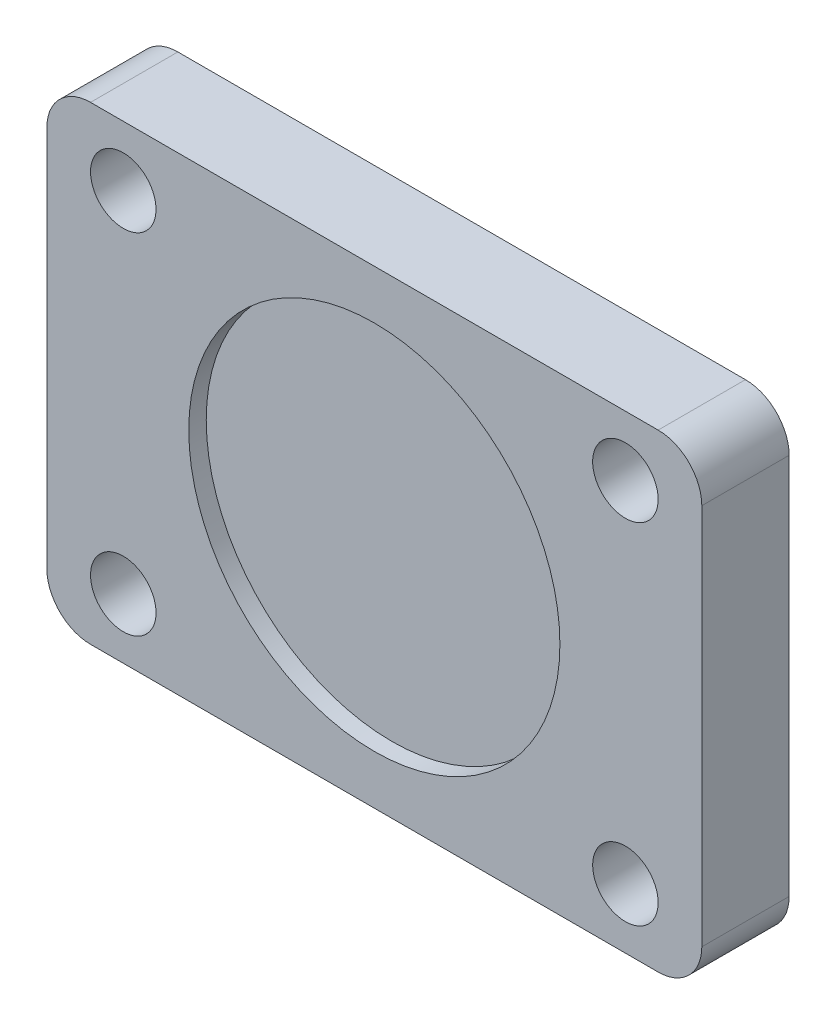
ISO-10303-21;
HEADER;
FILE_DESCRIPTION(('STEP AP214'),'2;1');
FILE_NAME('part.step','',(''),(''),'','','');
FILE_SCHEMA(('AUTOMOTIVE_DESIGN { 1 0 10303 214 1 1 1 1 }'));
ENDSEC;
DATA;
#1=APPLICATION_CONTEXT('core data for automotive mechanical design processes');
#2=APPLICATION_PROTOCOL_DEFINITION('international standard','automotive_design',2000,#1);
#3=PRODUCT_CONTEXT('',#1,'mechanical');
#4=PRODUCT('Part','Part','',(#3));
#5=PRODUCT_RELATED_PRODUCT_CATEGORY('part','',(#4));
#6=PRODUCT_DEFINITION_FORMATION('','',#4);
#7=PRODUCT_DEFINITION_CONTEXT('part definition',#1,'design');
#8=PRODUCT_DEFINITION('design','',#6,#7);
#9=PRODUCT_DEFINITION_SHAPE('','',#8);
#10=(LENGTH_UNIT() NAMED_UNIT(*) SI_UNIT(.MILLI.,.METRE.));
#11=(NAMED_UNIT(*) PLANE_ANGLE_UNIT() SI_UNIT($,.RADIAN.));
#12=(NAMED_UNIT(*) SI_UNIT($,.STERADIAN.) SOLID_ANGLE_UNIT());
#13=UNCERTAINTY_MEASURE_WITH_UNIT(LENGTH_MEASURE(1.E-05),#10,'distance_accuracy_value','');
#14=(GEOMETRIC_REPRESENTATION_CONTEXT(3) GLOBAL_UNCERTAINTY_ASSIGNED_CONTEXT((#13)) GLOBAL_UNIT_ASSIGNED_CONTEXT((#10,
#11,#12)) REPRESENTATION_CONTEXT('',''));
#15=CARTESIAN_POINT('',(0.,0.,0.));
#16=DIRECTION('',(0.,0.,1.));
#17=DIRECTION('',(1.,0.,0.));
#18=AXIS2_PLACEMENT_3D('',#15,#16,#17);
#19=CARTESIAN_POINT('',(0.,0.,8.));
#20=DIRECTION('',(0.,0.,1.));
#21=DIRECTION('',(1.,0.,0.));
#22=AXIS2_PLACEMENT_3D('',#19,#20,#21);
#23=PLANE('',#22);
#24=CARTESIAN_POINT('',(0.,0.,8.));
#25=DIRECTION('',(0.,0.,1.));
#26=DIRECTION('',(1.,0.,0.));
#27=AXIS2_PLACEMENT_3D('',#24,#25,#26);
#28=CIRCLE('',#27,17.);
#29=CARTESIAN_POINT('',(17.,0.,8.));
#30=VERTEX_POINT('',#29);
#31=EDGE_CURVE('E207',#30,#30,#28,.T.);
#32=ORIENTED_EDGE('',*,*,#31,.F.);
#33=EDGE_LOOP('',(#32));
#34=FACE_BOUND('',#33,.T.);
#35=CARTESIAN_POINT('',(-23.,-16.,8.));
#36=DIRECTION('',(0.,0.,1.));
#37=DIRECTION('',(1.,0.,0.));
#38=AXIS2_PLACEMENT_3D('',#35,#36,#37);
#39=CIRCLE('',#38,3.);
#40=CARTESIAN_POINT('',(-20.,-16.,8.));
#41=VERTEX_POINT('',#40);
#42=EDGE_CURVE('E192',#41,#41,#39,.T.);
#43=ORIENTED_EDGE('',*,*,#42,.F.);
#44=EDGE_LOOP('',(#43));
#45=FACE_BOUND('',#44,.T.);
#46=CARTESIAN_POINT('',(23.,16.,8.));
#47=DIRECTION('',(0.,0.,1.));
#48=DIRECTION('',(1.,0.,0.));
#49=AXIS2_PLACEMENT_3D('',#46,#47,#48);
#50=CIRCLE('',#49,3.);
#51=CARTESIAN_POINT('',(26.,16.,8.));
#52=VERTEX_POINT('',#51);
#53=EDGE_CURVE('E133',#52,#52,#50,.T.);
#54=ORIENTED_EDGE('',*,*,#53,.F.);
#55=EDGE_LOOP('',(#54));
#56=FACE_BOUND('',#55,.T.);
#57=DIRECTION('',(1.,0.,0.));
#58=VECTOR('',#57,1.);
#59=CARTESIAN_POINT('',(-30.,-21.5,8.));
#60=LINE('',#59,#58);
#61=CARTESIAN_POINT('',(-26.,-21.5,8.));
#62=VERTEX_POINT('',#61);
#63=CARTESIAN_POINT('',(26.,-21.5,8.));
#64=VERTEX_POINT('',#63);
#65=EDGE_CURVE('E142',#62,#64,#60,.T.);
#66=ORIENTED_EDGE('',*,*,#65,.T.);
#67=CARTESIAN_POINT('',(26.,-17.5,8.));
#68=DIRECTION('',(0.,0.,1.));
#69=DIRECTION('',(1.,0.,0.));
#70=AXIS2_PLACEMENT_3D('',#67,#68,#69);
#71=CIRCLE('',#70,4.);
#72=CARTESIAN_POINT('',(30.,-17.5,8.));
#73=VERTEX_POINT('',#72);
#74=EDGE_CURVE('E161',#64,#73,#71,.T.);
#75=ORIENTED_EDGE('',*,*,#74,.T.);
#76=DIRECTION('',(0.,1.,0.));
#77=VECTOR('',#76,1.);
#78=CARTESIAN_POINT('',(30.,21.5,8.));
#79=LINE('',#78,#77);
#80=CARTESIAN_POINT('',(30.,17.5,8.));
#81=VERTEX_POINT('',#80);
#82=EDGE_CURVE('E125',#73,#81,#79,.T.);
#83=ORIENTED_EDGE('',*,*,#82,.T.);
#84=CARTESIAN_POINT('',(26.,17.5,8.));
#85=DIRECTION('',(0.,0.,1.));
#86=DIRECTION('',(1.,0.,0.));
#87=AXIS2_PLACEMENT_3D('',#84,#85,#86);
#88=CIRCLE('',#87,4.);
#89=CARTESIAN_POINT('',(26.,21.5,8.));
#90=VERTEX_POINT('',#89);
#91=EDGE_CURVE('E156',#81,#90,#88,.T.);
#92=ORIENTED_EDGE('',*,*,#91,.T.);
#93=DIRECTION('',(-1.,0.,0.));
#94=VECTOR('',#93,1.);
#95=CARTESIAN_POINT('',(-30.,21.5,8.));
#96=LINE('',#95,#94);
#97=CARTESIAN_POINT('',(-26.,21.5,8.));
#98=VERTEX_POINT('',#97);
#99=EDGE_CURVE('E172',#90,#98,#96,.T.);
#100=ORIENTED_EDGE('',*,*,#99,.T.);
#101=CARTESIAN_POINT('',(-26.,17.5,8.));
#102=DIRECTION('',(0.,0.,1.));
#103=DIRECTION('',(1.,0.,0.));
#104=AXIS2_PLACEMENT_3D('',#101,#102,#103);
#105=CIRCLE('',#104,4.);
#106=CARTESIAN_POINT('',(-30.,17.5,8.));
#107=VERTEX_POINT('',#106);
#108=EDGE_CURVE('E61',#98,#107,#105,.T.);
#109=ORIENTED_EDGE('',*,*,#108,.T.);
#110=DIRECTION('',(0.,-1.,0.));
#111=VECTOR('',#110,1.);
#112=CARTESIAN_POINT('',(-30.,21.5,8.));
#113=LINE('',#112,#111);
#114=CARTESIAN_POINT('',(-30.,-17.5,8.));
#115=VERTEX_POINT('',#114);
#116=EDGE_CURVE('E180',#107,#115,#113,.T.);
#117=ORIENTED_EDGE('',*,*,#116,.T.);
#118=CARTESIAN_POINT('',(-26.,-17.5,8.));
#119=DIRECTION('',(0.,0.,1.));
#120=DIRECTION('',(1.,0.,0.));
#121=AXIS2_PLACEMENT_3D('',#118,#119,#120);
#122=CIRCLE('',#121,4.);
#123=EDGE_CURVE('E159',#115,#62,#122,.T.);
#124=ORIENTED_EDGE('',*,*,#123,.T.);
#125=EDGE_LOOP('',(#66,#75,#83,#92,#100,#109,#117,#124));
#126=FACE_BOUND('',#125,.T.);
#127=CARTESIAN_POINT('',(23.,-16.,8.));
#128=DIRECTION('',(0.,0.,1.));
#129=DIRECTION('',(-1.,0.,0.));
#130=AXIS2_PLACEMENT_3D('',#127,#128,#129);
#131=CIRCLE('',#130,3.);
#132=CARTESIAN_POINT('',(20.,-16.,8.));
#133=VERTEX_POINT('',#132);
#134=EDGE_CURVE('E187',#133,#133,#131,.T.);
#135=ORIENTED_EDGE('',*,*,#134,.F.);
#136=EDGE_LOOP('',(#135));
#137=FACE_BOUND('',#136,.T.);
#138=CARTESIAN_POINT('',(-23.,16.,8.));
#139=DIRECTION('',(0.,0.,1.));
#140=DIRECTION('',(-1.,0.,0.));
#141=AXIS2_PLACEMENT_3D('',#138,#139,#140);
#142=CIRCLE('',#141,3.);
#143=CARTESIAN_POINT('',(-26.,16.,8.));
#144=VERTEX_POINT('',#143);
#145=EDGE_CURVE('E198',#144,#144,#142,.T.);
#146=ORIENTED_EDGE('',*,*,#145,.F.);
#147=EDGE_LOOP('',(#146));
#148=FACE_BOUND('',#147,.T.);
#149=ADVANCED_FACE('F39',(#34,#45,#56,#126,#137,#148),#23,.T.);
#150=CARTESIAN_POINT('',(0.,0.,0.));
#151=DIRECTION('',(0.,0.,1.));
#152=DIRECTION('',(1.,0.,0.));
#153=AXIS2_PLACEMENT_3D('',#150,#151,#152);
#154=PLANE('',#153);
#155=DIRECTION('',(0.,1.,0.));
#156=VECTOR('',#155,1.);
#157=CARTESIAN_POINT('',(30.,21.5,0.));
#158=LINE('',#157,#156);
#159=CARTESIAN_POINT('',(30.,-17.5,0.));
#160=VERTEX_POINT('',#159);
#161=CARTESIAN_POINT('',(30.,17.5,0.));
#162=VERTEX_POINT('',#161);
#163=EDGE_CURVE('E122',#160,#162,#158,.T.);
#164=ORIENTED_EDGE('',*,*,#163,.F.);
#165=CARTESIAN_POINT('',(26.,-17.5,0.));
#166=DIRECTION('',(0.,0.,1.));
#167=DIRECTION('',(1.,0.,0.));
#168=AXIS2_PLACEMENT_3D('',#165,#166,#167);
#169=CIRCLE('',#168,4.);
#170=CARTESIAN_POINT('',(26.,-21.5,0.));
#171=VERTEX_POINT('',#170);
#172=EDGE_CURVE('E105',#160,#171,#169,.F.);
#173=ORIENTED_EDGE('',*,*,#172,.T.);
#174=DIRECTION('',(1.,0.,0.));
#175=VECTOR('',#174,1.);
#176=CARTESIAN_POINT('',(-30.,-21.5,0.));
#177=LINE('',#176,#175);
#178=CARTESIAN_POINT('',(-26.,-21.5,0.));
#179=VERTEX_POINT('',#178);
#180=EDGE_CURVE('E146',#179,#171,#177,.T.);
#181=ORIENTED_EDGE('',*,*,#180,.F.);
#182=CARTESIAN_POINT('',(-26.,-17.5,0.));
#183=DIRECTION('',(0.,0.,1.));
#184=DIRECTION('',(1.,0.,0.));
#185=AXIS2_PLACEMENT_3D('',#182,#183,#184);
#186=CIRCLE('',#185,4.);
#187=CARTESIAN_POINT('',(-30.,-17.5,0.));
#188=VERTEX_POINT('',#187);
#189=EDGE_CURVE('E116',#179,#188,#186,.F.);
#190=ORIENTED_EDGE('',*,*,#189,.T.);
#191=DIRECTION('',(0.,-1.,0.));
#192=VECTOR('',#191,1.);
#193=CARTESIAN_POINT('',(-30.,21.5,0.));
#194=LINE('',#193,#192);
#195=CARTESIAN_POINT('',(-30.,17.5,0.));
#196=VERTEX_POINT('',#195);
#197=EDGE_CURVE('E136',#196,#188,#194,.T.);
#198=ORIENTED_EDGE('',*,*,#197,.F.);
#199=CARTESIAN_POINT('',(-26.,17.5,0.));
#200=DIRECTION('',(0.,0.,1.));
#201=DIRECTION('',(1.,0.,0.));
#202=AXIS2_PLACEMENT_3D('',#199,#200,#201);
#203=CIRCLE('',#202,4.);
#204=CARTESIAN_POINT('',(-26.,21.5,0.));
#205=VERTEX_POINT('',#204);
#206=EDGE_CURVE('E150',#196,#205,#203,.F.);
#207=ORIENTED_EDGE('',*,*,#206,.T.);
#208=DIRECTION('',(-1.,0.,0.));
#209=VECTOR('',#208,1.);
#210=CARTESIAN_POINT('',(-30.,21.5,0.));
#211=LINE('',#210,#209);
#212=CARTESIAN_POINT('',(26.,21.5,0.));
#213=VERTEX_POINT('',#212);
#214=EDGE_CURVE('E132',#213,#205,#211,.T.);
#215=ORIENTED_EDGE('',*,*,#214,.F.);
#216=CARTESIAN_POINT('',(26.,17.5,0.));
#217=DIRECTION('',(0.,0.,1.));
#218=DIRECTION('',(1.,0.,0.));
#219=AXIS2_PLACEMENT_3D('',#216,#217,#218);
#220=CIRCLE('',#219,4.);
#221=EDGE_CURVE('E126',#213,#162,#220,.F.);
#222=ORIENTED_EDGE('',*,*,#221,.T.);
#223=EDGE_LOOP('',(#164,#173,#181,#190,#198,#207,#215,#222));
#224=FACE_BOUND('',#223,.T.);
#225=CARTESIAN_POINT('',(23.,16.,0.));
#226=DIRECTION('',(0.,0.,1.));
#227=DIRECTION('',(1.,0.,0.));
#228=AXIS2_PLACEMENT_3D('',#225,#226,#227);
#229=CIRCLE('',#228,3.);
#230=CARTESIAN_POINT('',(26.,16.,0.));
#231=VERTEX_POINT('',#230);
#232=EDGE_CURVE('E139',#231,#231,#229,.T.);
#233=ORIENTED_EDGE('',*,*,#232,.T.);
#234=EDGE_LOOP('',(#233));
#235=FACE_BOUND('',#234,.T.);
#236=CARTESIAN_POINT('',(23.,-16.,0.));
#237=DIRECTION('',(0.,0.,1.));
#238=DIRECTION('',(-1.,0.,0.));
#239=AXIS2_PLACEMENT_3D('',#236,#237,#238);
#240=CIRCLE('',#239,3.);
#241=CARTESIAN_POINT('',(20.,-16.,0.));
#242=VERTEX_POINT('',#241);
#243=EDGE_CURVE('E189',#242,#242,#240,.T.);
#244=ORIENTED_EDGE('',*,*,#243,.T.);
#245=EDGE_LOOP('',(#244));
#246=FACE_BOUND('',#245,.T.);
#247=CARTESIAN_POINT('',(-23.,-16.,0.));
#248=DIRECTION('',(0.,0.,1.));
#249=DIRECTION('',(1.,0.,0.));
#250=AXIS2_PLACEMENT_3D('',#247,#248,#249);
#251=CIRCLE('',#250,3.);
#252=CARTESIAN_POINT('',(-20.,-16.,0.));
#253=VERTEX_POINT('',#252);
#254=EDGE_CURVE('E195',#253,#253,#251,.T.);
#255=ORIENTED_EDGE('',*,*,#254,.T.);
#256=EDGE_LOOP('',(#255));
#257=FACE_BOUND('',#256,.T.);
#258=CARTESIAN_POINT('',(-23.,16.,0.));
#259=DIRECTION('',(0.,0.,1.));
#260=DIRECTION('',(-1.,0.,0.));
#261=AXIS2_PLACEMENT_3D('',#258,#259,#260);
#262=CIRCLE('',#261,3.);
#263=CARTESIAN_POINT('',(-26.,16.,0.));
#264=VERTEX_POINT('',#263);
#265=EDGE_CURVE('E201',#264,#264,#262,.T.);
#266=ORIENTED_EDGE('',*,*,#265,.T.);
#267=EDGE_LOOP('',(#266));
#268=FACE_BOUND('',#267,.T.);
#269=ADVANCED_FACE('F129',(#224,#235,#246,#257,#268),#154,.F.);
#270=CARTESIAN_POINT('',(30.,21.5,8.));
#271=DIRECTION('',(-1.,0.,0.));
#272=DIRECTION('',(0.,0.,1.));
#273=AXIS2_PLACEMENT_3D('',#270,#271,#272);
#274=PLANE('',#273);
#275=ORIENTED_EDGE('',*,*,#82,.F.);
#276=DIRECTION('',(0.,0.,-1.));
#277=VECTOR('',#276,1.);
#278=CARTESIAN_POINT('',(30.,-17.5,8.));
#279=LINE('',#278,#277);
#280=EDGE_CURVE('E109',#73,#160,#279,.T.);
#281=ORIENTED_EDGE('',*,*,#280,.T.);
#282=ORIENTED_EDGE('',*,*,#163,.T.);
#283=DIRECTION('',(0.,0.,-1.));
#284=VECTOR('',#283,1.);
#285=CARTESIAN_POINT('',(30.,17.5,8.));
#286=LINE('',#285,#284);
#287=EDGE_CURVE('E127',#162,#81,#286,.F.);
#288=ORIENTED_EDGE('',*,*,#287,.T.);
#289=EDGE_LOOP('',(#275,#281,#282,#288));
#290=FACE_BOUND('',#289,.T.);
#291=ADVANCED_FACE('F121',(#290),#274,.F.);
#292=CARTESIAN_POINT('',(-30.,21.5,8.));
#293=DIRECTION('',(0.,-1.,0.));
#294=DIRECTION('',(0.,0.,-1.));
#295=AXIS2_PLACEMENT_3D('',#292,#293,#294);
#296=PLANE('',#295);
#297=ORIENTED_EDGE('',*,*,#214,.T.);
#298=DIRECTION('',(0.,0.,-1.));
#299=VECTOR('',#298,1.);
#300=CARTESIAN_POINT('',(-26.,21.5,8.));
#301=LINE('',#300,#299);
#302=EDGE_CURVE('E11',#205,#98,#301,.F.);
#303=ORIENTED_EDGE('',*,*,#302,.T.);
#304=ORIENTED_EDGE('',*,*,#99,.F.);
#305=DIRECTION('',(0.,0.,-1.));
#306=VECTOR('',#305,1.);
#307=CARTESIAN_POINT('',(26.,21.5,8.));
#308=LINE('',#307,#306);
#309=EDGE_CURVE('E47',#90,#213,#308,.T.);
#310=ORIENTED_EDGE('',*,*,#309,.T.);
#311=EDGE_LOOP('',(#297,#303,#304,#310));
#312=FACE_BOUND('',#311,.T.);
#313=ADVANCED_FACE('F170',(#312),#296,.F.);
#314=CARTESIAN_POINT('',(-30.,21.5,8.));
#315=DIRECTION('',(1.,0.,0.));
#316=DIRECTION('',(0.,0.,-1.));
#317=AXIS2_PLACEMENT_3D('',#314,#315,#316);
#318=PLANE('',#317);
#319=ORIENTED_EDGE('',*,*,#197,.T.);
#320=DIRECTION('',(0.,0.,-1.));
#321=VECTOR('',#320,1.);
#322=CARTESIAN_POINT('',(-30.,-17.5,8.));
#323=LINE('',#322,#321);
#324=EDGE_CURVE('E54',#188,#115,#323,.F.);
#325=ORIENTED_EDGE('',*,*,#324,.T.);
#326=ORIENTED_EDGE('',*,*,#116,.F.);
#327=DIRECTION('',(0.,0.,-1.));
#328=VECTOR('',#327,1.);
#329=CARTESIAN_POINT('',(-30.,17.5,8.));
#330=LINE('',#329,#328);
#331=EDGE_CURVE('E163',#107,#196,#330,.T.);
#332=ORIENTED_EDGE('',*,*,#331,.T.);
#333=EDGE_LOOP('',(#319,#325,#326,#332));
#334=FACE_BOUND('',#333,.T.);
#335=ADVANCED_FACE('F179',(#334),#318,.F.);
#336=CARTESIAN_POINT('',(-30.,-21.5,8.));
#337=DIRECTION('',(0.,1.,0.));
#338=DIRECTION('',(0.,0.,1.));
#339=AXIS2_PLACEMENT_3D('',#336,#337,#338);
#340=PLANE('',#339);
#341=ORIENTED_EDGE('',*,*,#180,.T.);
#342=DIRECTION('',(0.,0.,-1.));
#343=VECTOR('',#342,1.);
#344=CARTESIAN_POINT('',(26.,-21.5,8.));
#345=LINE('',#344,#343);
#346=EDGE_CURVE('E110',#171,#64,#345,.F.);
#347=ORIENTED_EDGE('',*,*,#346,.T.);
#348=ORIENTED_EDGE('',*,*,#65,.F.);
#349=DIRECTION('',(0.,0.,-1.));
#350=VECTOR('',#349,1.);
#351=CARTESIAN_POINT('',(-26.,-21.5,8.));
#352=LINE('',#351,#350);
#353=EDGE_CURVE('E115',#62,#179,#352,.T.);
#354=ORIENTED_EDGE('',*,*,#353,.T.);
#355=EDGE_LOOP('',(#341,#347,#348,#354));
#356=FACE_BOUND('',#355,.T.);
#357=ADVANCED_FACE('F248',(#356),#340,.F.);
#358=CARTESIAN_POINT('',(23.,16.,8.));
#359=DIRECTION('',(0.,0.,-1.));
#360=DIRECTION('',(-1.,0.,0.));
#361=AXIS2_PLACEMENT_3D('',#358,#359,#360);
#362=CYLINDRICAL_SURFACE('',#361,3.);
#363=ORIENTED_EDGE('',*,*,#53,.T.);
#364=EDGE_LOOP('',(#363));
#365=FACE_BOUND('',#364,.T.);
#366=ORIENTED_EDGE('',*,*,#232,.F.);
#367=EDGE_LOOP('',(#366));
#368=FACE_BOUND('',#367,.T.);
#369=ADVANCED_FACE('F251',(#365,#368),#362,.F.);
#370=CARTESIAN_POINT('',(23.,-16.,8.));
#371=DIRECTION('',(0.,0.,-1.));
#372=DIRECTION('',(-1.,0.,0.));
#373=AXIS2_PLACEMENT_3D('',#370,#371,#372);
#374=CYLINDRICAL_SURFACE('',#373,3.);
#375=ORIENTED_EDGE('',*,*,#134,.T.);
#376=EDGE_LOOP('',(#375));
#377=FACE_BOUND('',#376,.T.);
#378=ORIENTED_EDGE('',*,*,#243,.F.);
#379=EDGE_LOOP('',(#378));
#380=FACE_BOUND('',#379,.T.);
#381=ADVANCED_FACE('F381',(#377,#380),#374,.F.);
#382=CARTESIAN_POINT('',(-23.,-16.,8.));
#383=DIRECTION('',(0.,0.,-1.));
#384=DIRECTION('',(-1.,0.,0.));
#385=AXIS2_PLACEMENT_3D('',#382,#383,#384);
#386=CYLINDRICAL_SURFACE('',#385,3.);
#387=ORIENTED_EDGE('',*,*,#42,.T.);
#388=EDGE_LOOP('',(#387));
#389=FACE_BOUND('',#388,.T.);
#390=ORIENTED_EDGE('',*,*,#254,.F.);
#391=EDGE_LOOP('',(#390));
#392=FACE_BOUND('',#391,.T.);
#393=ADVANCED_FACE('F236',(#389,#392),#386,.F.);
#394=CARTESIAN_POINT('',(-23.,16.,8.));
#395=DIRECTION('',(0.,0.,-1.));
#396=DIRECTION('',(-1.,0.,0.));
#397=AXIS2_PLACEMENT_3D('',#394,#395,#396);
#398=CYLINDRICAL_SURFACE('',#397,3.);
#399=ORIENTED_EDGE('',*,*,#145,.T.);
#400=EDGE_LOOP('',(#399));
#401=FACE_BOUND('',#400,.T.);
#402=ORIENTED_EDGE('',*,*,#265,.F.);
#403=EDGE_LOOP('',(#402));
#404=FACE_BOUND('',#403,.T.);
#405=ADVANCED_FACE('F233',(#401,#404),#398,.F.);
#406=CARTESIAN_POINT('',(26.,-17.5,8.));
#407=DIRECTION('',(0.,0.,-1.));
#408=DIRECTION('',(-1.,0.,0.));
#409=AXIS2_PLACEMENT_3D('',#406,#407,#408);
#410=CYLINDRICAL_SURFACE('',#409,4.);
#411=ORIENTED_EDGE('',*,*,#74,.F.);
#412=ORIENTED_EDGE('',*,*,#346,.F.);
#413=ORIENTED_EDGE('',*,*,#172,.F.);
#414=ORIENTED_EDGE('',*,*,#280,.F.);
#415=EDGE_LOOP('',(#411,#412,#413,#414));
#416=FACE_BOUND('',#415,.T.);
#417=ADVANCED_FACE('F108',(#416),#410,.T.);
#418=CARTESIAN_POINT('',(-26.,-17.5,8.));
#419=DIRECTION('',(0.,0.,-1.));
#420=DIRECTION('',(-1.,0.,0.));
#421=AXIS2_PLACEMENT_3D('',#418,#419,#420);
#422=CYLINDRICAL_SURFACE('',#421,4.);
#423=ORIENTED_EDGE('',*,*,#123,.F.);
#424=ORIENTED_EDGE('',*,*,#324,.F.);
#425=ORIENTED_EDGE('',*,*,#189,.F.);
#426=ORIENTED_EDGE('',*,*,#353,.F.);
#427=EDGE_LOOP('',(#423,#424,#425,#426));
#428=FACE_BOUND('',#427,.T.);
#429=ADVANCED_FACE('F259',(#428),#422,.T.);
#430=CARTESIAN_POINT('',(-26.,17.5,8.));
#431=DIRECTION('',(0.,0.,-1.));
#432=DIRECTION('',(-1.,0.,0.));
#433=AXIS2_PLACEMENT_3D('',#430,#431,#432);
#434=CYLINDRICAL_SURFACE('',#433,4.);
#435=ORIENTED_EDGE('',*,*,#108,.F.);
#436=ORIENTED_EDGE('',*,*,#302,.F.);
#437=ORIENTED_EDGE('',*,*,#206,.F.);
#438=ORIENTED_EDGE('',*,*,#331,.F.);
#439=EDGE_LOOP('',(#435,#436,#437,#438));
#440=FACE_BOUND('',#439,.T.);
#441=ADVANCED_FACE('F178',(#440),#434,.T.);
#442=CARTESIAN_POINT('',(26.,17.5,8.));
#443=DIRECTION('',(0.,0.,-1.));
#444=DIRECTION('',(-1.,0.,0.));
#445=AXIS2_PLACEMENT_3D('',#442,#443,#444);
#446=CYLINDRICAL_SURFACE('',#445,4.);
#447=ORIENTED_EDGE('',*,*,#91,.F.);
#448=ORIENTED_EDGE('',*,*,#287,.F.);
#449=ORIENTED_EDGE('',*,*,#221,.F.);
#450=ORIENTED_EDGE('',*,*,#309,.F.);
#451=EDGE_LOOP('',(#447,#448,#449,#450));
#452=FACE_BOUND('',#451,.T.);
#453=ADVANCED_FACE('F41',(#452),#446,.T.);
#454=CARTESIAN_POINT('',(0.,0.,6.4));
#455=DIRECTION('',(0.,0.,1.));
#456=DIRECTION('',(1.,0.,0.));
#457=AXIS2_PLACEMENT_3D('',#454,#455,#456);
#458=CYLINDRICAL_SURFACE('',#457,17.);
#459=CARTESIAN_POINT('',(0.,0.,6.4));
#460=DIRECTION('',(0.,0.,1.));
#461=DIRECTION('',(1.,0.,0.));
#462=AXIS2_PLACEMENT_3D('',#459,#460,#461);
#463=CIRCLE('',#462,17.);
#464=CARTESIAN_POINT('',(17.,0.,6.4));
#465=VERTEX_POINT('',#464);
#466=EDGE_CURVE('E204',#465,#465,#463,.T.);
#467=ORIENTED_EDGE('',*,*,#466,.F.);
#468=EDGE_LOOP('',(#467));
#469=FACE_BOUND('',#468,.T.);
#470=ORIENTED_EDGE('',*,*,#31,.T.);
#471=EDGE_LOOP('',(#470));
#472=FACE_BOUND('',#471,.T.);
#473=ADVANCED_FACE('F215',(#469,#472),#458,.F.);
#474=CARTESIAN_POINT('',(0.,0.,6.4));
#475=DIRECTION('',(0.,0.,1.));
#476=DIRECTION('',(1.,0.,0.));
#477=AXIS2_PLACEMENT_3D('',#474,#475,#476);
#478=PLANE('',#477);
#479=ORIENTED_EDGE('',*,*,#466,.T.);
#480=EDGE_LOOP('',(#479));
#481=FACE_BOUND('',#480,.T.);
#482=ADVANCED_FACE('F213',(#481),#478,.T.);
#483=CLOSED_SHELL('',(#149,#269,#291,#313,#335,#357,#369,#381,#393,#405,#417,#429,#441,#453,
#473,#482));
#484=MANIFOLD_SOLID_BREP('B2',#483);
#485=ADVANCED_BREP_SHAPE_REPRESENTATION('',(#18,#484),#14);
#486=SHAPE_DEFINITION_REPRESENTATION(#9,#485);
ENDSEC;
END-ISO-10303-21;
